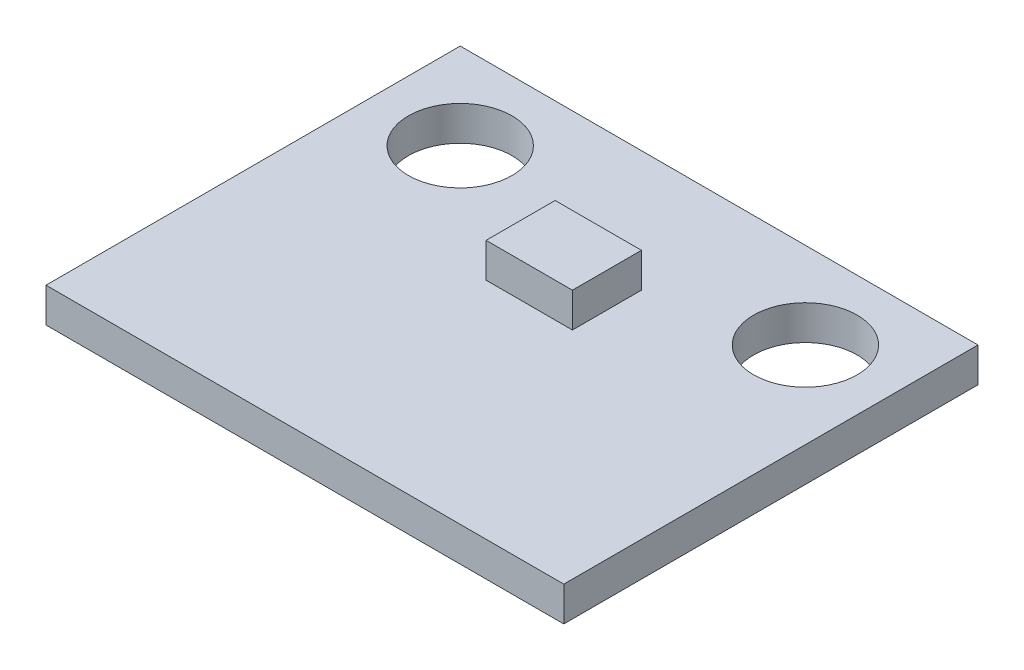
ISO-10303-21;
HEADER;
FILE_DESCRIPTION(('STEP AP214'),'2;1');
FILE_NAME('part.step','',(''),(''),'','','');
FILE_SCHEMA(('AUTOMOTIVE_DESIGN { 1 0 10303 214 1 1 1 1 }'));
ENDSEC;
DATA;
#1=APPLICATION_CONTEXT('core data for automotive mechanical design processes');
#2=APPLICATION_PROTOCOL_DEFINITION('international standard','automotive_design',2000,#1);
#3=PRODUCT_CONTEXT('',#1,'mechanical');
#4=PRODUCT('Part','Part','',(#3));
#5=PRODUCT_RELATED_PRODUCT_CATEGORY('part','',(#4));
#6=PRODUCT_DEFINITION_FORMATION('','',#4);
#7=PRODUCT_DEFINITION_CONTEXT('part definition',#1,'design');
#8=PRODUCT_DEFINITION('design','',#6,#7);
#9=PRODUCT_DEFINITION_SHAPE('','',#8);
#10=(LENGTH_UNIT() NAMED_UNIT(*) SI_UNIT(.MILLI.,.METRE.));
#11=(NAMED_UNIT(*) PLANE_ANGLE_UNIT() SI_UNIT($,.RADIAN.));
#12=(NAMED_UNIT(*) SI_UNIT($,.STERADIAN.) SOLID_ANGLE_UNIT());
#13=UNCERTAINTY_MEASURE_WITH_UNIT(LENGTH_MEASURE(1.E-05),#10,'distance_accuracy_value','');
#14=(GEOMETRIC_REPRESENTATION_CONTEXT(3) GLOBAL_UNCERTAINTY_ASSIGNED_CONTEXT((#13)) GLOBAL_UNIT_ASSIGNED_CONTEXT((#10,
#11,#12)) REPRESENTATION_CONTEXT('',''));
#15=CARTESIAN_POINT('',(0.,0.,0.));
#16=DIRECTION('',(0.,0.,1.));
#17=DIRECTION('',(1.,0.,0.));
#18=AXIS2_PLACEMENT_3D('',#15,#16,#17);
#19=CARTESIAN_POINT('',(0.,1.,0.));
#20=DIRECTION('',(0.,1.,0.));
#21=DIRECTION('',(0.,0.,1.));
#22=AXIS2_PLACEMENT_3D('',#19,#20,#21);
#23=PLANE('',#22);
#24=CARTESIAN_POINT('',(-5.,1.,-3.5));
#25=DIRECTION('',(0.,1.,0.));
#26=DIRECTION('',(0.,0.,1.));
#27=AXIS2_PLACEMENT_3D('',#24,#25,#26);
#28=CIRCLE('',#27,1.5);
#29=CARTESIAN_POINT('',(-5.,1.,-2.));
#30=VERTEX_POINT('',#29);
#31=EDGE_CURVE('E142',#30,#30,#28,.T.);
#32=ORIENTED_EDGE('',*,*,#31,.F.);
#33=EDGE_LOOP('',(#32));
#34=FACE_BOUND('',#33,.T.);
#35=DIRECTION('',(0.,0.,-1.));
#36=VECTOR('',#35,1.);
#37=CARTESIAN_POINT('',(7.5,1.,-6.));
#38=LINE('',#37,#36);
#39=CARTESIAN_POINT('',(7.5,1.,6.));
#40=VERTEX_POINT('',#39);
#41=CARTESIAN_POINT('',(7.5,1.,-6.));
#42=VERTEX_POINT('',#41);
#43=EDGE_CURVE('E148',#40,#42,#38,.T.);
#44=ORIENTED_EDGE('',*,*,#43,.T.);
#45=DIRECTION('',(-1.,0.,0.));
#46=VECTOR('',#45,1.);
#47=CARTESIAN_POINT('',(-7.5,1.,-6.));
#48=LINE('',#47,#46);
#49=CARTESIAN_POINT('',(-7.5,1.,-6.));
#50=VERTEX_POINT('',#49);
#51=EDGE_CURVE('E84',#42,#50,#48,.T.);
#52=ORIENTED_EDGE('',*,*,#51,.T.);
#53=DIRECTION('',(0.,0.,1.));
#54=VECTOR('',#53,1.);
#55=CARTESIAN_POINT('',(-7.5,1.,-6.));
#56=LINE('',#55,#54);
#57=CARTESIAN_POINT('',(-7.5,1.,6.));
#58=VERTEX_POINT('',#57);
#59=EDGE_CURVE('E151',#50,#58,#56,.T.);
#60=ORIENTED_EDGE('',*,*,#59,.T.);
#61=DIRECTION('',(1.,0.,0.));
#62=VECTOR('',#61,1.);
#63=CARTESIAN_POINT('',(-7.5,1.,6.));
#64=LINE('',#63,#62);
#65=EDGE_CURVE('E56',#58,#40,#64,.T.);
#66=ORIENTED_EDGE('',*,*,#65,.T.);
#67=EDGE_LOOP('',(#44,#52,#60,#66));
#68=FACE_BOUND('',#67,.T.);
#69=CARTESIAN_POINT('',(5.,1.,-3.5));
#70=DIRECTION('',(0.,1.,0.));
#71=DIRECTION('',(0.,0.,1.));
#72=AXIS2_PLACEMENT_3D('',#69,#70,#71);
#73=CIRCLE('',#72,1.5);
#74=CARTESIAN_POINT('',(5.,1.,-2.));
#75=VERTEX_POINT('',#74);
#76=EDGE_CURVE('E134',#75,#75,#73,.T.);
#77=ORIENTED_EDGE('',*,*,#76,.F.);
#78=EDGE_LOOP('',(#77));
#79=FACE_BOUND('',#78,.T.);
#80=DIRECTION('',(-1.,0.,0.));
#81=VECTOR('',#80,1.);
#82=CARTESIAN_POINT('',(-1.25,1.,-2.5));
#83=LINE('',#82,#81);
#84=CARTESIAN_POINT('',(1.25,1.,-2.5));
#85=VERTEX_POINT('',#84);
#86=CARTESIAN_POINT('',(-1.25,1.,-2.5));
#87=VERTEX_POINT('',#86);
#88=EDGE_CURVE('E297',#85,#87,#83,.T.);
#89=ORIENTED_EDGE('',*,*,#88,.F.);
#90=DIRECTION('',(0.,0.,-1.));
#91=VECTOR('',#90,1.);
#92=CARTESIAN_POINT('',(1.25,1.,-2.5));
#93=LINE('',#92,#91);
#94=CARTESIAN_POINT('',(1.25,1.,-0.5));
#95=VERTEX_POINT('',#94);
#96=EDGE_CURVE('E129',#95,#85,#93,.T.);
#97=ORIENTED_EDGE('',*,*,#96,.F.);
#98=DIRECTION('',(1.,0.,0.));
#99=VECTOR('',#98,1.);
#100=CARTESIAN_POINT('',(-1.25,1.,-0.5));
#101=LINE('',#100,#99);
#102=CARTESIAN_POINT('',(-1.25,1.,-0.5));
#103=VERTEX_POINT('',#102);
#104=EDGE_CURVE('E125',#103,#95,#101,.T.);
#105=ORIENTED_EDGE('',*,*,#104,.F.);
#106=DIRECTION('',(0.,0.,1.));
#107=VECTOR('',#106,1.);
#108=CARTESIAN_POINT('',(-1.25,1.,-2.5));
#109=LINE('',#108,#107);
#110=EDGE_CURVE('E294',#87,#103,#109,.T.);
#111=ORIENTED_EDGE('',*,*,#110,.F.);
#112=EDGE_LOOP('',(#89,#97,#105,#111));
#113=FACE_BOUND('',#112,.T.);
#114=ADVANCED_FACE('F32',(#34,#68,#79,#113),#23,.T.);
#115=CARTESIAN_POINT('',(0.,0.,0.));
#116=DIRECTION('',(0.,1.,0.));
#117=DIRECTION('',(0.,0.,1.));
#118=AXIS2_PLACEMENT_3D('',#115,#116,#117);
#119=PLANE('',#118);
#120=DIRECTION('',(0.,0.,-1.));
#121=VECTOR('',#120,1.);
#122=CARTESIAN_POINT('',(7.5,0.,-6.));
#123=LINE('',#122,#121);
#124=CARTESIAN_POINT('',(7.5,0.,6.));
#125=VERTEX_POINT('',#124);
#126=CARTESIAN_POINT('',(7.5,0.,-6.));
#127=VERTEX_POINT('',#126);
#128=EDGE_CURVE('E145',#125,#127,#123,.T.);
#129=ORIENTED_EDGE('',*,*,#128,.F.);
#130=DIRECTION('',(1.,0.,0.));
#131=VECTOR('',#130,1.);
#132=CARTESIAN_POINT('',(-7.5,0.,6.));
#133=LINE('',#132,#131);
#134=CARTESIAN_POINT('',(-7.5,0.,6.));
#135=VERTEX_POINT('',#134);
#136=EDGE_CURVE('E77',#135,#125,#133,.T.);
#137=ORIENTED_EDGE('',*,*,#136,.F.);
#138=DIRECTION('',(0.,0.,1.));
#139=VECTOR('',#138,1.);
#140=CARTESIAN_POINT('',(-7.5,0.,-6.));
#141=LINE('',#140,#139);
#142=CARTESIAN_POINT('',(-7.5,0.,-6.));
#143=VERTEX_POINT('',#142);
#144=EDGE_CURVE('E159',#143,#135,#141,.T.);
#145=ORIENTED_EDGE('',*,*,#144,.F.);
#146=DIRECTION('',(-1.,0.,0.));
#147=VECTOR('',#146,1.);
#148=CARTESIAN_POINT('',(-7.5,0.,-6.));
#149=LINE('',#148,#147);
#150=EDGE_CURVE('E157',#127,#143,#149,.T.);
#151=ORIENTED_EDGE('',*,*,#150,.F.);
#152=EDGE_LOOP('',(#129,#137,#145,#151));
#153=FACE_BOUND('',#152,.T.);
#154=CARTESIAN_POINT('',(-5.,0.,-3.5));
#155=DIRECTION('',(0.,1.,0.));
#156=DIRECTION('',(0.,0.,1.));
#157=AXIS2_PLACEMENT_3D('',#154,#155,#156);
#158=CIRCLE('',#157,1.5);
#159=CARTESIAN_POINT('',(-5.,0.,-2.));
#160=VERTEX_POINT('',#159);
#161=EDGE_CURVE('E140',#160,#160,#158,.T.);
#162=ORIENTED_EDGE('',*,*,#161,.T.);
#163=EDGE_LOOP('',(#162));
#164=FACE_BOUND('',#163,.T.);
#165=CARTESIAN_POINT('',(5.,0.,-3.5));
#166=DIRECTION('',(0.,1.,0.));
#167=DIRECTION('',(0.,0.,1.));
#168=AXIS2_PLACEMENT_3D('',#165,#166,#167);
#169=CIRCLE('',#168,1.5);
#170=CARTESIAN_POINT('',(5.,0.,-2.));
#171=VERTEX_POINT('',#170);
#172=EDGE_CURVE('E131',#171,#171,#169,.T.);
#173=ORIENTED_EDGE('',*,*,#172,.T.);
#174=EDGE_LOOP('',(#173));
#175=FACE_BOUND('',#174,.T.);
#176=ADVANCED_FACE('F172',(#153,#164,#175),#119,.F.);
#177=CARTESIAN_POINT('',(7.5,1.,-6.));
#178=DIRECTION('',(-1.,0.,0.));
#179=DIRECTION('',(0.,0.,1.));
#180=AXIS2_PLACEMENT_3D('',#177,#178,#179);
#181=PLANE('',#180);
#182=ORIENTED_EDGE('',*,*,#128,.T.);
#183=DIRECTION('',(0.,-1.,0.));
#184=VECTOR('',#183,1.);
#185=CARTESIAN_POINT('',(7.5,1.,-6.));
#186=LINE('',#185,#184);
#187=EDGE_CURVE('E11',#42,#127,#186,.T.);
#188=ORIENTED_EDGE('',*,*,#187,.F.);
#189=ORIENTED_EDGE('',*,*,#43,.F.);
#190=DIRECTION('',(0.,-1.,0.));
#191=VECTOR('',#190,1.);
#192=CARTESIAN_POINT('',(7.5,1.,6.));
#193=LINE('',#192,#191);
#194=EDGE_CURVE('E154',#40,#125,#193,.T.);
#195=ORIENTED_EDGE('',*,*,#194,.T.);
#196=EDGE_LOOP('',(#182,#188,#189,#195));
#197=FACE_BOUND('',#196,.T.);
#198=ADVANCED_FACE('F34',(#197),#181,.F.);
#199=CARTESIAN_POINT('',(-7.5,1.,-6.));
#200=DIRECTION('',(0.,0.,1.));
#201=DIRECTION('',(1.,0.,0.));
#202=AXIS2_PLACEMENT_3D('',#199,#200,#201);
#203=PLANE('',#202);
#204=ORIENTED_EDGE('',*,*,#150,.T.);
#205=DIRECTION('',(0.,-1.,0.));
#206=VECTOR('',#205,1.);
#207=CARTESIAN_POINT('',(-7.5,1.,-6.));
#208=LINE('',#207,#206);
#209=EDGE_CURVE('E40',#50,#143,#208,.T.);
#210=ORIENTED_EDGE('',*,*,#209,.F.);
#211=ORIENTED_EDGE('',*,*,#51,.F.);
#212=ORIENTED_EDGE('',*,*,#187,.T.);
#213=EDGE_LOOP('',(#204,#210,#211,#212));
#214=FACE_BOUND('',#213,.T.);
#215=ADVANCED_FACE('F188',(#214),#203,.F.);
#216=CARTESIAN_POINT('',(-7.5,1.,-6.));
#217=DIRECTION('',(1.,0.,0.));
#218=DIRECTION('',(0.,0.,-1.));
#219=AXIS2_PLACEMENT_3D('',#216,#217,#218);
#220=PLANE('',#219);
#221=ORIENTED_EDGE('',*,*,#144,.T.);
#222=DIRECTION('',(0.,-1.,0.));
#223=VECTOR('',#222,1.);
#224=CARTESIAN_POINT('',(-7.5,1.,6.));
#225=LINE('',#224,#223);
#226=EDGE_CURVE('E163',#58,#135,#225,.T.);
#227=ORIENTED_EDGE('',*,*,#226,.F.);
#228=ORIENTED_EDGE('',*,*,#59,.F.);
#229=ORIENTED_EDGE('',*,*,#209,.T.);
#230=EDGE_LOOP('',(#221,#227,#228,#229));
#231=FACE_BOUND('',#230,.T.);
#232=ADVANCED_FACE('F168',(#231),#220,.F.);
#233=CARTESIAN_POINT('',(-7.5,1.,6.));
#234=DIRECTION('',(0.,0.,-1.));
#235=DIRECTION('',(-1.,0.,0.));
#236=AXIS2_PLACEMENT_3D('',#233,#234,#235);
#237=PLANE('',#236);
#238=ORIENTED_EDGE('',*,*,#136,.T.);
#239=ORIENTED_EDGE('',*,*,#194,.F.);
#240=ORIENTED_EDGE('',*,*,#65,.F.);
#241=ORIENTED_EDGE('',*,*,#226,.T.);
#242=EDGE_LOOP('',(#238,#239,#240,#241));
#243=FACE_BOUND('',#242,.T.);
#244=ADVANCED_FACE('F177',(#243),#237,.F.);
#245=CARTESIAN_POINT('',(-5.,1.,-3.5));
#246=DIRECTION('',(0.,-1.,0.));
#247=DIRECTION('',(0.,0.,-1.));
#248=AXIS2_PLACEMENT_3D('',#245,#246,#247);
#249=CYLINDRICAL_SURFACE('',#248,1.5);
#250=ORIENTED_EDGE('',*,*,#31,.T.);
#251=EDGE_LOOP('',(#250));
#252=FACE_BOUND('',#251,.T.);
#253=ORIENTED_EDGE('',*,*,#161,.F.);
#254=EDGE_LOOP('',(#253));
#255=FACE_BOUND('',#254,.T.);
#256=ADVANCED_FACE('F179',(#252,#255),#249,.F.);
#257=CARTESIAN_POINT('',(5.,1.,-3.5));
#258=DIRECTION('',(0.,-1.,0.));
#259=DIRECTION('',(0.,0.,-1.));
#260=AXIS2_PLACEMENT_3D('',#257,#258,#259);
#261=CYLINDRICAL_SURFACE('',#260,1.5);
#262=ORIENTED_EDGE('',*,*,#76,.T.);
#263=EDGE_LOOP('',(#262));
#264=FACE_BOUND('',#263,.T.);
#265=ORIENTED_EDGE('',*,*,#172,.F.);
#266=EDGE_LOOP('',(#265));
#267=FACE_BOUND('',#266,.T.);
#268=ADVANCED_FACE('F185',(#264,#267),#261,.F.);
#269=CARTESIAN_POINT('',(1.25,2.,-2.5));
#270=DIRECTION('',(-1.,0.,0.));
#271=DIRECTION('',(0.,0.,1.));
#272=AXIS2_PLACEMENT_3D('',#269,#270,#271);
#273=PLANE('',#272);
#274=ORIENTED_EDGE('',*,*,#96,.T.);
#275=DIRECTION('',(0.,-1.,0.));
#276=VECTOR('',#275,1.);
#277=CARTESIAN_POINT('',(1.25,2.,-2.5));
#278=LINE('',#277,#276);
#279=CARTESIAN_POINT('',(1.25,2.,-2.5));
#280=VERTEX_POINT('',#279);
#281=EDGE_CURVE('E110',#280,#85,#278,.T.);
#282=ORIENTED_EDGE('',*,*,#281,.F.);
#283=DIRECTION('',(0.,0.,-1.));
#284=VECTOR('',#283,1.);
#285=CARTESIAN_POINT('',(1.25,2.,-2.5));
#286=LINE('',#285,#284);
#287=CARTESIAN_POINT('',(1.25,2.,-0.5));
#288=VERTEX_POINT('',#287);
#289=EDGE_CURVE('E117',#288,#280,#286,.T.);
#290=ORIENTED_EDGE('',*,*,#289,.F.);
#291=DIRECTION('',(0.,-1.,0.));
#292=VECTOR('',#291,1.);
#293=CARTESIAN_POINT('',(1.25,2.,-0.5));
#294=LINE('',#293,#292);
#295=EDGE_CURVE('E291',#288,#95,#294,.T.);
#296=ORIENTED_EDGE('',*,*,#295,.T.);
#297=EDGE_LOOP('',(#274,#282,#290,#296));
#298=FACE_BOUND('',#297,.T.);
#299=ADVANCED_FACE('F127',(#298),#273,.F.);
#300=CARTESIAN_POINT('',(-1.25,2.,-2.5));
#301=DIRECTION('',(0.,0.,1.));
#302=DIRECTION('',(1.,0.,0.));
#303=AXIS2_PLACEMENT_3D('',#300,#301,#302);
#304=PLANE('',#303);
#305=ORIENTED_EDGE('',*,*,#88,.T.);
#306=DIRECTION('',(0.,-1.,0.));
#307=VECTOR('',#306,1.);
#308=CARTESIAN_POINT('',(-1.25,2.,-2.5));
#309=LINE('',#308,#307);
#310=CARTESIAN_POINT('',(-1.25,2.,-2.5));
#311=VERTEX_POINT('',#310);
#312=EDGE_CURVE('E113',#311,#87,#309,.T.);
#313=ORIENTED_EDGE('',*,*,#312,.F.);
#314=DIRECTION('',(-1.,0.,0.));
#315=VECTOR('',#314,1.);
#316=CARTESIAN_POINT('',(-1.25,2.,-2.5));
#317=LINE('',#316,#315);
#318=EDGE_CURVE('E106',#280,#311,#317,.T.);
#319=ORIENTED_EDGE('',*,*,#318,.F.);
#320=ORIENTED_EDGE('',*,*,#281,.T.);
#321=EDGE_LOOP('',(#305,#313,#319,#320));
#322=FACE_BOUND('',#321,.T.);
#323=ADVANCED_FACE('F108',(#322),#304,.F.);
#324=CARTESIAN_POINT('',(-1.25,2.,-2.5));
#325=DIRECTION('',(1.,0.,0.));
#326=DIRECTION('',(0.,0.,-1.));
#327=AXIS2_PLACEMENT_3D('',#324,#325,#326);
#328=PLANE('',#327);
#329=ORIENTED_EDGE('',*,*,#110,.T.);
#330=DIRECTION('',(0.,-1.,0.));
#331=VECTOR('',#330,1.);
#332=CARTESIAN_POINT('',(-1.25,2.,-0.5));
#333=LINE('',#332,#331);
#334=CARTESIAN_POINT('',(-1.25,2.,-0.5));
#335=VERTEX_POINT('',#334);
#336=EDGE_CURVE('E47',#335,#103,#333,.T.);
#337=ORIENTED_EDGE('',*,*,#336,.F.);
#338=DIRECTION('',(0.,0.,1.));
#339=VECTOR('',#338,1.);
#340=CARTESIAN_POINT('',(-1.25,2.,-2.5));
#341=LINE('',#340,#339);
#342=EDGE_CURVE('E116',#311,#335,#341,.T.);
#343=ORIENTED_EDGE('',*,*,#342,.F.);
#344=ORIENTED_EDGE('',*,*,#312,.T.);
#345=EDGE_LOOP('',(#329,#337,#343,#344));
#346=FACE_BOUND('',#345,.T.);
#347=ADVANCED_FACE('F206',(#346),#328,.F.);
#348=CARTESIAN_POINT('',(-1.25,2.,-0.5));
#349=DIRECTION('',(0.,0.,-1.));
#350=DIRECTION('',(-1.,0.,0.));
#351=AXIS2_PLACEMENT_3D('',#348,#349,#350);
#352=PLANE('',#351);
#353=ORIENTED_EDGE('',*,*,#104,.T.);
#354=ORIENTED_EDGE('',*,*,#295,.F.);
#355=DIRECTION('',(1.,0.,0.));
#356=VECTOR('',#355,1.);
#357=CARTESIAN_POINT('',(-1.25,2.,-0.5));
#358=LINE('',#357,#356);
#359=EDGE_CURVE('E121',#335,#288,#358,.T.);
#360=ORIENTED_EDGE('',*,*,#359,.F.);
#361=ORIENTED_EDGE('',*,*,#336,.T.);
#362=EDGE_LOOP('',(#353,#354,#360,#361));
#363=FACE_BOUND('',#362,.T.);
#364=ADVANCED_FACE('F209',(#363),#352,.F.);
#365=CARTESIAN_POINT('',(0.,2.,0.));
#366=DIRECTION('',(0.,1.,0.));
#367=DIRECTION('',(0.,0.,1.));
#368=AXIS2_PLACEMENT_3D('',#365,#366,#367);
#369=PLANE('',#368);
#370=ORIENTED_EDGE('',*,*,#289,.T.);
#371=ORIENTED_EDGE('',*,*,#318,.T.);
#372=ORIENTED_EDGE('',*,*,#342,.T.);
#373=ORIENTED_EDGE('',*,*,#359,.T.);
#374=EDGE_LOOP('',(#370,#371,#372,#373));
#375=FACE_BOUND('',#374,.T.);
#376=ADVANCED_FACE('F120',(#375),#369,.T.);
#377=CLOSED_SHELL('',(#114,#176,#198,#215,#232,#244,#256,#268,#299,#323,#347,#364,#376));
#378=MANIFOLD_SOLID_BREP('B2',#377);
#379=ADVANCED_BREP_SHAPE_REPRESENTATION('',(#18,#378),#14);
#380=SHAPE_DEFINITION_REPRESENTATION(#9,#379);
ENDSEC;
END-ISO-10303-21;
